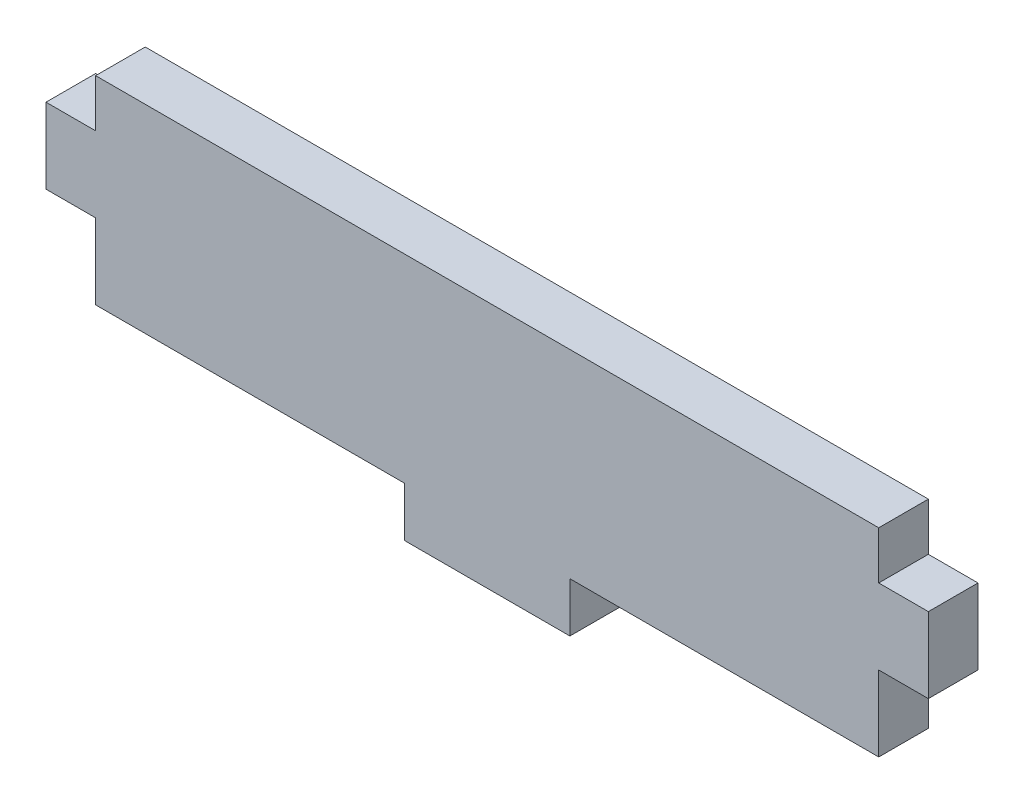
ISO-10303-21;
HEADER;
FILE_DESCRIPTION(('STEP AP214'),'2;1');
FILE_NAME('part.step','',(''),(''),'','','');
FILE_SCHEMA(('AUTOMOTIVE_DESIGN { 1 0 10303 214 1 1 1 1 }'));
ENDSEC;
DATA;
#1=APPLICATION_CONTEXT('core data for automotive mechanical design processes');
#2=APPLICATION_PROTOCOL_DEFINITION('international standard','automotive_design',2000,#1);
#3=PRODUCT_CONTEXT('',#1,'mechanical');
#4=PRODUCT('Part','Part','',(#3));
#5=PRODUCT_RELATED_PRODUCT_CATEGORY('part','',(#4));
#6=PRODUCT_DEFINITION_FORMATION('','',#4);
#7=PRODUCT_DEFINITION_CONTEXT('part definition',#1,'design');
#8=PRODUCT_DEFINITION('design','',#6,#7);
#9=PRODUCT_DEFINITION_SHAPE('','',#8);
#10=(LENGTH_UNIT() NAMED_UNIT(*) SI_UNIT(.MILLI.,.METRE.));
#11=(NAMED_UNIT(*) PLANE_ANGLE_UNIT() SI_UNIT($,.RADIAN.));
#12=(NAMED_UNIT(*) SI_UNIT($,.STERADIAN.) SOLID_ANGLE_UNIT());
#13=UNCERTAINTY_MEASURE_WITH_UNIT(LENGTH_MEASURE(1.E-05),#10,'distance_accuracy_value','');
#14=(GEOMETRIC_REPRESENTATION_CONTEXT(3) GLOBAL_UNCERTAINTY_ASSIGNED_CONTEXT((#13)) GLOBAL_UNIT_ASSIGNED_CONTEXT((#10,
#11,#12)) REPRESENTATION_CONTEXT('',''));
#15=CARTESIAN_POINT('',(0.,0.,0.));
#16=DIRECTION('',(0.,0.,1.));
#17=DIRECTION('',(1.,0.,0.));
#18=AXIS2_PLACEMENT_3D('',#15,#16,#17);
#19=CARTESIAN_POINT('',(0.,9.,9.));
#20=DIRECTION('',(0.,1.,0.));
#21=DIRECTION('',(-1.,0.,0.));
#22=AXIS2_PLACEMENT_3D('',#19,#20,#21);
#23=PLANE('',#22);
#24=DIRECTION('',(1.,0.,0.));
#25=VECTOR('',#24,1.);
#26=CARTESIAN_POINT('',(0.,9.,0.));
#27=LINE('',#26,#25);
#28=CARTESIAN_POINT('',(9.,9.,0.));
#29=VERTEX_POINT('',#28);
#30=CARTESIAN_POINT('',(65.,8.99999999999999,0.));
#31=VERTEX_POINT('',#30);
#32=EDGE_CURVE('E183',#29,#31,#27,.T.);
#33=ORIENTED_EDGE('',*,*,#32,.T.);
#34=DIRECTION('',(0.,0.,-1.));
#35=VECTOR('',#34,1.);
#36=CARTESIAN_POINT('',(65.,8.99999999999999,9.));
#37=LINE('',#36,#35);
#38=CARTESIAN_POINT('',(65.,8.99999999999999,9.));
#39=VERTEX_POINT('',#38);
#40=EDGE_CURVE('E11',#39,#31,#37,.T.);
#41=ORIENTED_EDGE('',*,*,#40,.F.);
#42=DIRECTION('',(1.,0.,0.));
#43=VECTOR('',#42,1.);
#44=CARTESIAN_POINT('',(0.,9.,9.));
#45=LINE('',#44,#43);
#46=CARTESIAN_POINT('',(9.,9.,9.));
#47=VERTEX_POINT('',#46);
#48=EDGE_CURVE('E266',#47,#39,#45,.T.);
#49=ORIENTED_EDGE('',*,*,#48,.F.);
#50=DIRECTION('',(0.,0.,-1.));
#51=VECTOR('',#50,1.);
#52=CARTESIAN_POINT('',(9.,9.,9.));
#53=LINE('',#52,#51);
#54=EDGE_CURVE('E217',#47,#29,#53,.T.);
#55=ORIENTED_EDGE('',*,*,#54,.T.);
#56=EDGE_LOOP('',(#33,#41,#49,#55));
#57=FACE_BOUND('',#56,.T.);
#58=ADVANCED_FACE('F39',(#57),#23,.F.);
#59=CARTESIAN_POINT('',(65.,0.,9.));
#60=DIRECTION('',(1.,0.,0.));
#61=DIRECTION('',(0.,0.,-1.));
#62=AXIS2_PLACEMENT_3D('',#59,#60,#61);
#63=PLANE('',#62);
#64=DIRECTION('',(0.,-1.,0.));
#65=VECTOR('',#64,1.);
#66=CARTESIAN_POINT('',(65.,0.,0.));
#67=LINE('',#66,#65);
#68=CARTESIAN_POINT('',(65.,0.,0.));
#69=VERTEX_POINT('',#68);
#70=EDGE_CURVE('E186',#31,#69,#67,.T.);
#71=ORIENTED_EDGE('',*,*,#70,.T.);
#72=DIRECTION('',(0.,0.,-1.));
#73=VECTOR('',#72,1.);
#74=CARTESIAN_POINT('',(65.,0.,9.));
#75=LINE('',#74,#73);
#76=CARTESIAN_POINT('',(65.,0.,9.));
#77=VERTEX_POINT('',#76);
#78=EDGE_CURVE('E48',#77,#69,#75,.T.);
#79=ORIENTED_EDGE('',*,*,#78,.F.);
#80=DIRECTION('',(0.,-1.,0.));
#81=VECTOR('',#80,1.);
#82=CARTESIAN_POINT('',(65.,0.,9.));
#83=LINE('',#82,#81);
#84=EDGE_CURVE('E122',#39,#77,#83,.T.);
#85=ORIENTED_EDGE('',*,*,#84,.F.);
#86=ORIENTED_EDGE('',*,*,#40,.T.);
#87=EDGE_LOOP('',(#71,#79,#85,#86));
#88=FACE_BOUND('',#87,.T.);
#89=ADVANCED_FACE('F41',(#88),#63,.F.);
#90=CARTESIAN_POINT('',(0.,0.,9.));
#91=DIRECTION('',(0.,1.,0.));
#92=DIRECTION('',(-1.,0.,0.));
#93=AXIS2_PLACEMENT_3D('',#90,#91,#92);
#94=PLANE('',#93);
#95=DIRECTION('',(1.,0.,0.));
#96=VECTOR('',#95,1.);
#97=CARTESIAN_POINT('',(0.,0.,0.));
#98=LINE('',#97,#96);
#99=CARTESIAN_POINT('',(95.,0.,0.));
#100=VERTEX_POINT('',#99);
#101=EDGE_CURVE('E189',#69,#100,#98,.T.);
#102=ORIENTED_EDGE('',*,*,#101,.T.);
#103=DIRECTION('',(0.,0.,-1.));
#104=VECTOR('',#103,1.);
#105=CARTESIAN_POINT('',(95.,0.,9.));
#106=LINE('',#105,#104);
#107=CARTESIAN_POINT('',(95.,0.,9.));
#108=VERTEX_POINT('',#107);
#109=EDGE_CURVE('E242',#108,#100,#106,.T.);
#110=ORIENTED_EDGE('',*,*,#109,.F.);
#111=DIRECTION('',(1.,0.,0.));
#112=VECTOR('',#111,1.);
#113=CARTESIAN_POINT('',(0.,0.,9.));
#114=LINE('',#113,#112);
#115=EDGE_CURVE('E249',#77,#108,#114,.T.);
#116=ORIENTED_EDGE('',*,*,#115,.F.);
#117=ORIENTED_EDGE('',*,*,#78,.T.);
#118=EDGE_LOOP('',(#102,#110,#116,#117));
#119=FACE_BOUND('',#118,.T.);
#120=ADVANCED_FACE('F247',(#119),#94,.F.);
#121=CARTESIAN_POINT('',(95.,0.,9.));
#122=DIRECTION('',(1.,0.,0.));
#123=DIRECTION('',(0.,0.,-1.));
#124=AXIS2_PLACEMENT_3D('',#121,#122,#123);
#125=PLANE('',#124);
#126=DIRECTION('',(0.,-1.,0.));
#127=VECTOR('',#126,1.);
#128=CARTESIAN_POINT('',(95.,0.,0.));
#129=LINE('',#128,#127);
#130=CARTESIAN_POINT('',(95.,8.99999999999999,0.));
#131=VERTEX_POINT('',#130);
#132=EDGE_CURVE('E192',#131,#100,#129,.T.);
#133=ORIENTED_EDGE('',*,*,#132,.F.);
#134=DIRECTION('',(0.,0.,-1.));
#135=VECTOR('',#134,1.);
#136=CARTESIAN_POINT('',(95.,8.99999999999999,9.));
#137=LINE('',#136,#135);
#138=CARTESIAN_POINT('',(95.,8.99999999999999,9.));
#139=VERTEX_POINT('',#138);
#140=EDGE_CURVE('E240',#139,#131,#137,.T.);
#141=ORIENTED_EDGE('',*,*,#140,.F.);
#142=DIRECTION('',(0.,-1.,0.));
#143=VECTOR('',#142,1.);
#144=CARTESIAN_POINT('',(95.,0.,9.));
#145=LINE('',#144,#143);
#146=EDGE_CURVE('E261',#139,#108,#145,.T.);
#147=ORIENTED_EDGE('',*,*,#146,.T.);
#148=ORIENTED_EDGE('',*,*,#109,.T.);
#149=EDGE_LOOP('',(#133,#141,#147,#148));
#150=FACE_BOUND('',#149,.T.);
#151=ADVANCED_FACE('F257',(#150),#125,.T.);
#152=CARTESIAN_POINT('',(151.,8.99999999999998,0.));
#153=VERTEX_POINT('',#152);
#154=EDGE_CURVE('E187',#131,#153,#27,.T.);
#155=ORIENTED_EDGE('',*,*,#154,.T.);
#156=DIRECTION('',(0.,0.,-1.));
#157=VECTOR('',#156,1.);
#158=CARTESIAN_POINT('',(151.,8.99999999999998,9.));
#159=LINE('',#158,#157);
#160=CARTESIAN_POINT('',(151.,8.99999999999998,9.));
#161=VERTEX_POINT('',#160);
#162=EDGE_CURVE('E237',#161,#153,#159,.T.);
#163=ORIENTED_EDGE('',*,*,#162,.F.);
#164=EDGE_CURVE('E262',#139,#161,#45,.T.);
#165=ORIENTED_EDGE('',*,*,#164,.F.);
#166=ORIENTED_EDGE('',*,*,#140,.T.);
#167=EDGE_LOOP('',(#155,#163,#165,#166));
#168=FACE_BOUND('',#167,.T.);
#169=ADVANCED_FACE('F299',(#168),#23,.F.);
#170=CARTESIAN_POINT('',(151.,-1.16419219943332E-13,9.));
#171=DIRECTION('',(-1.,0.,0.));
#172=DIRECTION('',(0.,-1.,0.));
#173=AXIS2_PLACEMENT_3D('',#170,#171,#172);
#174=PLANE('',#173);
#175=DIRECTION('',(0.,1.,0.));
#176=VECTOR('',#175,1.);
#177=CARTESIAN_POINT('',(151.,-1.16419219943332E-13,0.));
#178=LINE('',#177,#176);
#179=CARTESIAN_POINT('',(151.,22.6666666666667,0.));
#180=VERTEX_POINT('',#179);
#181=EDGE_CURVE('E195',#153,#180,#178,.T.);
#182=ORIENTED_EDGE('',*,*,#181,.T.);
#183=DIRECTION('',(0.,0.,-1.));
#184=VECTOR('',#183,1.);
#185=CARTESIAN_POINT('',(151.,22.6666666666667,9.));
#186=LINE('',#185,#184);
#187=CARTESIAN_POINT('',(151.,22.6666666666667,9.));
#188=VERTEX_POINT('',#187);
#189=EDGE_CURVE('E235',#188,#180,#186,.T.);
#190=ORIENTED_EDGE('',*,*,#189,.F.);
#191=DIRECTION('',(0.,1.,0.));
#192=VECTOR('',#191,1.);
#193=CARTESIAN_POINT('',(151.,-1.16419219943332E-13,9.));
#194=LINE('',#193,#192);
#195=EDGE_CURVE('E264',#161,#188,#194,.T.);
#196=ORIENTED_EDGE('',*,*,#195,.F.);
#197=ORIENTED_EDGE('',*,*,#162,.T.);
#198=EDGE_LOOP('',(#182,#190,#196,#197));
#199=FACE_BOUND('',#198,.T.);
#200=ADVANCED_FACE('F305',(#199),#174,.F.);
#201=CARTESIAN_POINT('',(0.,22.6666666666666,9.));
#202=DIRECTION('',(0.,-1.,0.));
#203=DIRECTION('',(1.,0.,0.));
#204=AXIS2_PLACEMENT_3D('',#201,#202,#203);
#205=PLANE('',#204);
#206=DIRECTION('',(-1.,0.,0.));
#207=VECTOR('',#206,1.);
#208=CARTESIAN_POINT('',(0.,22.6666666666666,0.));
#209=LINE('',#208,#207);
#210=CARTESIAN_POINT('',(160.,22.6666666666667,0.));
#211=VERTEX_POINT('',#210);
#212=EDGE_CURVE('E198',#211,#180,#209,.T.);
#213=ORIENTED_EDGE('',*,*,#212,.F.);
#214=DIRECTION('',(0.,0.,-1.));
#215=VECTOR('',#214,1.);
#216=CARTESIAN_POINT('',(160.,22.6666666666667,9.));
#217=LINE('',#216,#215);
#218=CARTESIAN_POINT('',(160.,22.6666666666667,9.));
#219=VERTEX_POINT('',#218);
#220=EDGE_CURVE('E233',#219,#211,#217,.T.);
#221=ORIENTED_EDGE('',*,*,#220,.F.);
#222=DIRECTION('',(-1.,0.,0.));
#223=VECTOR('',#222,1.);
#224=CARTESIAN_POINT('',(0.,22.6666666666666,9.));
#225=LINE('',#224,#223);
#226=EDGE_CURVE('E271',#219,#188,#225,.T.);
#227=ORIENTED_EDGE('',*,*,#226,.T.);
#228=ORIENTED_EDGE('',*,*,#189,.T.);
#229=EDGE_LOOP('',(#213,#221,#227,#228));
#230=FACE_BOUND('',#229,.T.);
#231=ADVANCED_FACE('F311',(#230),#205,.T.);
#232=CARTESIAN_POINT('',(160.,0.,9.));
#233=DIRECTION('',(-1.,0.,0.));
#234=DIRECTION('',(0.,-1.,0.));
#235=AXIS2_PLACEMENT_3D('',#232,#233,#234);
#236=PLANE('',#235);
#237=DIRECTION('',(0.,1.,0.));
#238=VECTOR('',#237,1.);
#239=CARTESIAN_POINT('',(160.,0.,0.));
#240=LINE('',#239,#238);
#241=CARTESIAN_POINT('',(160.,36.3333333333334,0.));
#242=VERTEX_POINT('',#241);
#243=EDGE_CURVE('E202',#211,#242,#240,.T.);
#244=ORIENTED_EDGE('',*,*,#243,.T.);
#245=DIRECTION('',(0.,0.,-1.));
#246=VECTOR('',#245,1.);
#247=CARTESIAN_POINT('',(160.,36.3333333333334,9.));
#248=LINE('',#247,#246);
#249=CARTESIAN_POINT('',(160.,36.3333333333334,9.));
#250=VERTEX_POINT('',#249);
#251=EDGE_CURVE('E230',#250,#242,#248,.T.);
#252=ORIENTED_EDGE('',*,*,#251,.F.);
#253=DIRECTION('',(0.,1.,0.));
#254=VECTOR('',#253,1.);
#255=CARTESIAN_POINT('',(160.,0.,9.));
#256=LINE('',#255,#254);
#257=EDGE_CURVE('E275',#219,#250,#256,.T.);
#258=ORIENTED_EDGE('',*,*,#257,.F.);
#259=ORIENTED_EDGE('',*,*,#220,.T.);
#260=EDGE_LOOP('',(#244,#252,#258,#259));
#261=FACE_BOUND('',#260,.T.);
#262=ADVANCED_FACE('F328',(#261),#236,.F.);
#263=CARTESIAN_POINT('',(0.,36.3333333333334,9.));
#264=DIRECTION('',(0.,-1.,0.));
#265=DIRECTION('',(0.,0.,-1.));
#266=AXIS2_PLACEMENT_3D('',#263,#264,#265);
#267=PLANE('',#266);
#268=DIRECTION('',(-1.,0.,0.));
#269=VECTOR('',#268,1.);
#270=CARTESIAN_POINT('',(0.,36.3333333333334,0.));
#271=LINE('',#270,#269);
#272=CARTESIAN_POINT('',(151.,36.3333333333334,0.));
#273=VERTEX_POINT('',#272);
#274=EDGE_CURVE('E204',#242,#273,#271,.T.);
#275=ORIENTED_EDGE('',*,*,#274,.T.);
#276=DIRECTION('',(0.,0.,-1.));
#277=VECTOR('',#276,1.);
#278=CARTESIAN_POINT('',(151.,36.3333333333334,9.));
#279=LINE('',#278,#277);
#280=CARTESIAN_POINT('',(151.,36.3333333333334,9.));
#281=VERTEX_POINT('',#280);
#282=EDGE_CURVE('E227',#281,#273,#279,.T.);
#283=ORIENTED_EDGE('',*,*,#282,.F.);
#284=DIRECTION('',(-1.,0.,0.));
#285=VECTOR('',#284,1.);
#286=CARTESIAN_POINT('',(0.,36.3333333333334,9.));
#287=LINE('',#286,#285);
#288=EDGE_CURVE('E277',#250,#281,#287,.T.);
#289=ORIENTED_EDGE('',*,*,#288,.F.);
#290=ORIENTED_EDGE('',*,*,#251,.T.);
#291=EDGE_LOOP('',(#275,#283,#289,#290));
#292=FACE_BOUND('',#291,.T.);
#293=ADVANCED_FACE('F330',(#292),#267,.F.);
#294=CARTESIAN_POINT('',(151.,45.,0.));
#295=VERTEX_POINT('',#294);
#296=EDGE_CURVE('E199',#273,#295,#178,.T.);
#297=ORIENTED_EDGE('',*,*,#296,.T.);
#298=DIRECTION('',(0.,0.,-1.));
#299=VECTOR('',#298,1.);
#300=CARTESIAN_POINT('',(151.,45.,9.));
#301=LINE('',#300,#299);
#302=CARTESIAN_POINT('',(151.,45.,9.));
#303=VERTEX_POINT('',#302);
#304=EDGE_CURVE('E225',#303,#295,#301,.T.);
#305=ORIENTED_EDGE('',*,*,#304,.F.);
#306=EDGE_CURVE('E272',#281,#303,#194,.T.);
#307=ORIENTED_EDGE('',*,*,#306,.F.);
#308=ORIENTED_EDGE('',*,*,#282,.T.);
#309=EDGE_LOOP('',(#297,#305,#307,#308));
#310=FACE_BOUND('',#309,.T.);
#311=ADVANCED_FACE('F314',(#310),#174,.F.);
#312=CARTESIAN_POINT('',(0.,45.,9.));
#313=DIRECTION('',(0.,1.,0.));
#314=DIRECTION('',(-1.,0.,0.));
#315=AXIS2_PLACEMENT_3D('',#312,#313,#314);
#316=PLANE('',#315);
#317=DIRECTION('',(1.,0.,0.));
#318=VECTOR('',#317,1.);
#319=CARTESIAN_POINT('',(0.,45.,0.));
#320=LINE('',#319,#318);
#321=CARTESIAN_POINT('',(9.,45.,0.));
#322=VERTEX_POINT('',#321);
#323=EDGE_CURVE('E206',#322,#295,#320,.T.);
#324=ORIENTED_EDGE('',*,*,#323,.F.);
#325=DIRECTION('',(0.,0.,-1.));
#326=VECTOR('',#325,1.);
#327=CARTESIAN_POINT('',(9.,45.,9.));
#328=LINE('',#327,#326);
#329=CARTESIAN_POINT('',(9.,45.,9.));
#330=VERTEX_POINT('',#329);
#331=EDGE_CURVE('E223',#330,#322,#328,.T.);
#332=ORIENTED_EDGE('',*,*,#331,.F.);
#333=DIRECTION('',(1.,0.,0.));
#334=VECTOR('',#333,1.);
#335=CARTESIAN_POINT('',(0.,45.,9.));
#336=LINE('',#335,#334);
#337=EDGE_CURVE('E279',#330,#303,#336,.T.);
#338=ORIENTED_EDGE('',*,*,#337,.T.);
#339=ORIENTED_EDGE('',*,*,#304,.T.);
#340=EDGE_LOOP('',(#324,#332,#338,#339));
#341=FACE_BOUND('',#340,.T.);
#342=ADVANCED_FACE('F338',(#341),#316,.T.);
#343=CARTESIAN_POINT('',(9.,0.,9.));
#344=DIRECTION('',(1.,0.,0.));
#345=DIRECTION('',(0.,1.,0.));
#346=AXIS2_PLACEMENT_3D('',#343,#344,#345);
#347=PLANE('',#346);
#348=DIRECTION('',(0.,-1.,0.));
#349=VECTOR('',#348,1.);
#350=CARTESIAN_POINT('',(9.,0.,0.));
#351=LINE('',#350,#349);
#352=CARTESIAN_POINT('',(9.,36.3333333333333,0.));
#353=VERTEX_POINT('',#352);
#354=EDGE_CURVE('E209',#322,#353,#351,.T.);
#355=ORIENTED_EDGE('',*,*,#354,.T.);
#356=DIRECTION('',(0.,0.,-1.));
#357=VECTOR('',#356,1.);
#358=CARTESIAN_POINT('',(9.,36.3333333333333,9.));
#359=LINE('',#358,#357);
#360=CARTESIAN_POINT('',(9.,36.3333333333333,9.));
#361=VERTEX_POINT('',#360);
#362=EDGE_CURVE('E221',#361,#353,#359,.T.);
#363=ORIENTED_EDGE('',*,*,#362,.F.);
#364=DIRECTION('',(0.,-1.,0.));
#365=VECTOR('',#364,1.);
#366=CARTESIAN_POINT('',(9.,0.,9.));
#367=LINE('',#366,#365);
#368=EDGE_CURVE('E179',#330,#361,#367,.T.);
#369=ORIENTED_EDGE('',*,*,#368,.F.);
#370=ORIENTED_EDGE('',*,*,#331,.T.);
#371=EDGE_LOOP('',(#355,#363,#369,#370));
#372=FACE_BOUND('',#371,.T.);
#373=ADVANCED_FACE('F285',(#372),#347,.F.);
#374=CARTESIAN_POINT('',(0.,36.3333333333333,9.));
#375=DIRECTION('',(0.,1.,0.));
#376=DIRECTION('',(0.,0.,1.));
#377=AXIS2_PLACEMENT_3D('',#374,#375,#376);
#378=PLANE('',#377);
#379=DIRECTION('',(1.,0.,0.));
#380=VECTOR('',#379,1.);
#381=CARTESIAN_POINT('',(0.,36.3333333333333,0.));
#382=LINE('',#381,#380);
#383=CARTESIAN_POINT('',(0.,36.3333333333333,0.));
#384=VERTEX_POINT('',#383);
#385=EDGE_CURVE('E212',#384,#353,#382,.T.);
#386=ORIENTED_EDGE('',*,*,#385,.F.);
#387=DIRECTION('',(0.,0.,-1.));
#388=VECTOR('',#387,1.);
#389=CARTESIAN_POINT('',(0.,36.3333333333333,9.));
#390=LINE('',#389,#388);
#391=CARTESIAN_POINT('',(0.,36.3333333333333,9.));
#392=VERTEX_POINT('',#391);
#393=EDGE_CURVE('E168',#392,#384,#390,.T.);
#394=ORIENTED_EDGE('',*,*,#393,.F.);
#395=DIRECTION('',(1.,0.,0.));
#396=VECTOR('',#395,1.);
#397=CARTESIAN_POINT('',(0.,36.3333333333333,9.));
#398=LINE('',#397,#396);
#399=EDGE_CURVE('E177',#392,#361,#398,.T.);
#400=ORIENTED_EDGE('',*,*,#399,.T.);
#401=ORIENTED_EDGE('',*,*,#362,.T.);
#402=EDGE_LOOP('',(#386,#394,#400,#401));
#403=FACE_BOUND('',#402,.T.);
#404=ADVANCED_FACE('F289',(#403),#378,.T.);
#405=CARTESIAN_POINT('',(0.,0.,9.));
#406=DIRECTION('',(-1.,0.,0.));
#407=DIRECTION('',(0.,0.,1.));
#408=AXIS2_PLACEMENT_3D('',#405,#406,#407);
#409=PLANE('',#408);
#410=DIRECTION('',(0.,1.,0.));
#411=VECTOR('',#410,1.);
#412=CARTESIAN_POINT('',(0.,0.,0.));
#413=LINE('',#412,#411);
#414=CARTESIAN_POINT('',(0.,22.6666666666667,0.));
#415=VERTEX_POINT('',#414);
#416=EDGE_CURVE('E167',#415,#384,#413,.T.);
#417=ORIENTED_EDGE('',*,*,#416,.F.);
#418=DIRECTION('',(0.,0.,-1.));
#419=VECTOR('',#418,1.);
#420=CARTESIAN_POINT('',(0.,22.6666666666667,9.));
#421=LINE('',#420,#419);
#422=CARTESIAN_POINT('',(0.,22.6666666666667,9.));
#423=VERTEX_POINT('',#422);
#424=EDGE_CURVE('E161',#423,#415,#421,.T.);
#425=ORIENTED_EDGE('',*,*,#424,.F.);
#426=DIRECTION('',(0.,1.,0.));
#427=VECTOR('',#426,1.);
#428=CARTESIAN_POINT('',(0.,0.,9.));
#429=LINE('',#428,#427);
#430=EDGE_CURVE('E165',#423,#392,#429,.T.);
#431=ORIENTED_EDGE('',*,*,#430,.T.);
#432=ORIENTED_EDGE('',*,*,#393,.T.);
#433=EDGE_LOOP('',(#417,#425,#431,#432));
#434=FACE_BOUND('',#433,.T.);
#435=ADVANCED_FACE('F163',(#434),#409,.T.);
#436=CARTESIAN_POINT('',(0.,22.6666666666667,9.));
#437=DIRECTION('',(0.,1.,0.));
#438=DIRECTION('',(0.,0.,1.));
#439=AXIS2_PLACEMENT_3D('',#436,#437,#438);
#440=PLANE('',#439);
#441=DIRECTION('',(1.,0.,0.));
#442=VECTOR('',#441,1.);
#443=CARTESIAN_POINT('',(0.,22.6666666666667,0.));
#444=LINE('',#443,#442);
#445=CARTESIAN_POINT('',(9.,22.6666666666667,0.));
#446=VERTEX_POINT('',#445);
#447=EDGE_CURVE('E108',#415,#446,#444,.T.);
#448=ORIENTED_EDGE('',*,*,#447,.T.);
#449=DIRECTION('',(0.,0.,-1.));
#450=VECTOR('',#449,1.);
#451=CARTESIAN_POINT('',(9.,22.6666666666667,9.));
#452=LINE('',#451,#450);
#453=CARTESIAN_POINT('',(9.,22.6666666666667,9.));
#454=VERTEX_POINT('',#453);
#455=EDGE_CURVE('E169',#454,#446,#452,.T.);
#456=ORIENTED_EDGE('',*,*,#455,.F.);
#457=DIRECTION('',(1.,0.,0.));
#458=VECTOR('',#457,1.);
#459=CARTESIAN_POINT('',(0.,22.6666666666667,9.));
#460=LINE('',#459,#458);
#461=EDGE_CURVE('E171',#423,#454,#460,.T.);
#462=ORIENTED_EDGE('',*,*,#461,.F.);
#463=ORIENTED_EDGE('',*,*,#424,.T.);
#464=EDGE_LOOP('',(#448,#456,#462,#463));
#465=FACE_BOUND('',#464,.T.);
#466=ADVANCED_FACE('F172',(#465),#440,.F.);
#467=EDGE_CURVE('E114',#446,#29,#351,.T.);
#468=ORIENTED_EDGE('',*,*,#467,.T.);
#469=ORIENTED_EDGE('',*,*,#54,.F.);
#470=EDGE_CURVE('E56',#454,#47,#367,.T.);
#471=ORIENTED_EDGE('',*,*,#470,.F.);
#472=ORIENTED_EDGE('',*,*,#455,.T.);
#473=EDGE_LOOP('',(#468,#469,#471,#472));
#474=FACE_BOUND('',#473,.T.);
#475=ADVANCED_FACE('F346',(#474),#347,.F.);
#476=CARTESIAN_POINT('',(0.,0.,9.));
#477=DIRECTION('',(0.,0.,1.));
#478=DIRECTION('',(1.,0.,0.));
#479=AXIS2_PLACEMENT_3D('',#476,#477,#478);
#480=PLANE('',#479);
#481=ORIENTED_EDGE('',*,*,#48,.T.);
#482=ORIENTED_EDGE('',*,*,#84,.T.);
#483=ORIENTED_EDGE('',*,*,#115,.T.);
#484=ORIENTED_EDGE('',*,*,#146,.F.);
#485=ORIENTED_EDGE('',*,*,#164,.T.);
#486=ORIENTED_EDGE('',*,*,#195,.T.);
#487=ORIENTED_EDGE('',*,*,#226,.F.);
#488=ORIENTED_EDGE('',*,*,#257,.T.);
#489=ORIENTED_EDGE('',*,*,#288,.T.);
#490=ORIENTED_EDGE('',*,*,#306,.T.);
#491=ORIENTED_EDGE('',*,*,#337,.F.);
#492=ORIENTED_EDGE('',*,*,#368,.T.);
#493=ORIENTED_EDGE('',*,*,#399,.F.);
#494=ORIENTED_EDGE('',*,*,#430,.F.);
#495=ORIENTED_EDGE('',*,*,#461,.T.);
#496=ORIENTED_EDGE('',*,*,#470,.T.);
#497=EDGE_LOOP('',(#481,#482,#483,#484,#485,#486,#487,#488,#489,#490,#491,#492,#493,#494,#495,#496));
#498=FACE_BOUND('',#497,.T.);
#499=ADVANCED_FACE('F175',(#498),#480,.T.);
#500=CARTESIAN_POINT('',(0.,0.,0.));
#501=DIRECTION('',(0.,0.,1.));
#502=DIRECTION('',(1.,0.,0.));
#503=AXIS2_PLACEMENT_3D('',#500,#501,#502);
#504=PLANE('',#503);
#505=ORIENTED_EDGE('',*,*,#32,.F.);
#506=ORIENTED_EDGE('',*,*,#467,.F.);
#507=ORIENTED_EDGE('',*,*,#447,.F.);
#508=ORIENTED_EDGE('',*,*,#416,.T.);
#509=ORIENTED_EDGE('',*,*,#385,.T.);
#510=ORIENTED_EDGE('',*,*,#354,.F.);
#511=ORIENTED_EDGE('',*,*,#323,.T.);
#512=ORIENTED_EDGE('',*,*,#296,.F.);
#513=ORIENTED_EDGE('',*,*,#274,.F.);
#514=ORIENTED_EDGE('',*,*,#243,.F.);
#515=ORIENTED_EDGE('',*,*,#212,.T.);
#516=ORIENTED_EDGE('',*,*,#181,.F.);
#517=ORIENTED_EDGE('',*,*,#154,.F.);
#518=ORIENTED_EDGE('',*,*,#132,.T.);
#519=ORIENTED_EDGE('',*,*,#101,.F.);
#520=ORIENTED_EDGE('',*,*,#70,.F.);
#521=EDGE_LOOP('',(#505,#506,#507,#508,#509,#510,#511,#512,#513,#514,#515,#516,#517,#518,#519,#520));
#522=FACE_BOUND('',#521,.T.);
#523=ADVANCED_FACE('F252',(#522),#504,.F.);
#524=CLOSED_SHELL('',(#58,#89,#120,#151,#169,#200,#231,#262,#293,#311,#342,#373,#404,#435,#466,
#475,#499,#523));
#525=MANIFOLD_SOLID_BREP('B2',#524);
#526=ADVANCED_BREP_SHAPE_REPRESENTATION('',(#18,#525),#14);
#527=SHAPE_DEFINITION_REPRESENTATION(#9,#526);
ENDSEC;
END-ISO-10303-21;
